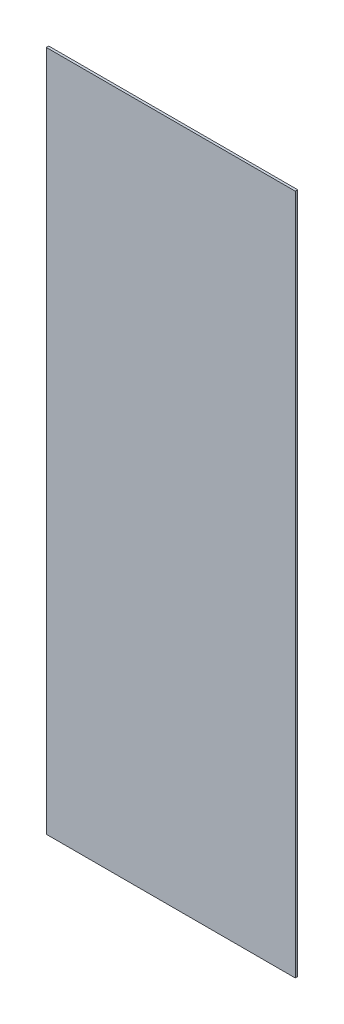
ISO-10303-21;
HEADER;
FILE_DESCRIPTION(('STEP AP214'),'2;1');
FILE_NAME('part.step','',(''),(''),'','','');
FILE_SCHEMA(('AUTOMOTIVE_DESIGN { 1 0 10303 214 1 1 1 1 }'));
ENDSEC;
DATA;
#1=APPLICATION_CONTEXT('core data for automotive mechanical design processes');
#2=APPLICATION_PROTOCOL_DEFINITION('international standard','automotive_design',2000,#1);
#3=PRODUCT_CONTEXT('',#1,'mechanical');
#4=PRODUCT('Part','Part','',(#3));
#5=PRODUCT_RELATED_PRODUCT_CATEGORY('part','',(#4));
#6=PRODUCT_DEFINITION_FORMATION('','',#4);
#7=PRODUCT_DEFINITION_CONTEXT('part definition',#1,'design');
#8=PRODUCT_DEFINITION('design','',#6,#7);
#9=PRODUCT_DEFINITION_SHAPE('','',#8);
#10=(LENGTH_UNIT() NAMED_UNIT(*) SI_UNIT(.MILLI.,.METRE.));
#11=(NAMED_UNIT(*) PLANE_ANGLE_UNIT() SI_UNIT($,.RADIAN.));
#12=(NAMED_UNIT(*) SI_UNIT($,.STERADIAN.) SOLID_ANGLE_UNIT());
#13=UNCERTAINTY_MEASURE_WITH_UNIT(LENGTH_MEASURE(1.E-05),#10,'distance_accuracy_value','');
#14=(GEOMETRIC_REPRESENTATION_CONTEXT(3) GLOBAL_UNCERTAINTY_ASSIGNED_CONTEXT((#13)) GLOBAL_UNIT_ASSIGNED_CONTEXT((#10,
#11,#12)) REPRESENTATION_CONTEXT('',''));
#15=CARTESIAN_POINT('',(0.,0.,0.));
#16=DIRECTION('',(0.,0.,1.));
#17=DIRECTION('',(1.,0.,0.));
#18=AXIS2_PLACEMENT_3D('',#15,#16,#17);
#19=CARTESIAN_POINT('',(28.125,177.7,-0.49));
#20=DIRECTION('',(0.,0.,1.));
#21=DIRECTION('',(1.,0.,0.));
#22=AXIS2_PLACEMENT_3D('',#19,#20,#21);
#23=PLANE('',#22);
#24=CARTESIAN_POINT('',(28.125,177.7,-0.49));
#25=DIRECTION('',(0.,0.,1.));
#26=DIRECTION('',(1.,0.,0.));
#27=AXIS2_PLACEMENT_3D('',#24,#25,#26);
#28=CIRCLE('',#27,0.5);
#29=CARTESIAN_POINT('',(28.625,177.7,-0.49));
#30=VERTEX_POINT('',#29);
#31=EDGE_CURVE('E19',#30,#30,#28,.F.);
#32=ORIENTED_EDGE('',*,*,#31,.T.);
#33=EDGE_LOOP('',(#32));
#34=FACE_BOUND('',#33,.T.);
#35=ADVANCED_FACE('F16',(#34),#23,.F.);
#36=CARTESIAN_POINT('',(28.125,-57.7,-0.49));
#37=DIRECTION('',(0.,0.,1.));
#38=DIRECTION('',(1.,0.,0.));
#39=AXIS2_PLACEMENT_3D('',#36,#37,#38);
#40=PLANE('',#39);
#41=CARTESIAN_POINT('',(28.125,-57.7,-0.49));
#42=DIRECTION('',(0.,0.,1.));
#43=DIRECTION('',(1.,0.,0.));
#44=AXIS2_PLACEMENT_3D('',#41,#42,#43);
#45=CIRCLE('',#44,0.5);
#46=CARTESIAN_POINT('',(28.625,-57.7,-0.49));
#47=VERTEX_POINT('',#46);
#48=EDGE_CURVE('E98',#47,#47,#45,.F.);
#49=ORIENTED_EDGE('',*,*,#48,.T.);
#50=EDGE_LOOP('',(#49));
#51=FACE_BOUND('',#50,.T.);
#52=ADVANCED_FACE('F205',(#51),#40,.F.);
#53=CARTESIAN_POINT('',(-28.125,177.7,-0.49));
#54=DIRECTION('',(0.,0.,1.));
#55=DIRECTION('',(1.,0.,0.));
#56=AXIS2_PLACEMENT_3D('',#53,#54,#55);
#57=PLANE('',#56);
#58=CARTESIAN_POINT('',(-28.125,177.7,-0.49));
#59=DIRECTION('',(0.,0.,1.));
#60=DIRECTION('',(1.,0.,0.));
#61=AXIS2_PLACEMENT_3D('',#58,#59,#60);
#62=CIRCLE('',#61,0.5);
#63=CARTESIAN_POINT('',(-27.625,177.7,-0.49));
#64=VERTEX_POINT('',#63);
#65=EDGE_CURVE('E96',#64,#64,#62,.F.);
#66=ORIENTED_EDGE('',*,*,#65,.T.);
#67=EDGE_LOOP('',(#66));
#68=FACE_BOUND('',#67,.T.);
#69=ADVANCED_FACE('F197',(#68),#57,.F.);
#70=CARTESIAN_POINT('',(-28.125,-57.7,-0.49));
#71=DIRECTION('',(0.,0.,1.));
#72=DIRECTION('',(1.,0.,0.));
#73=AXIS2_PLACEMENT_3D('',#70,#71,#72);
#74=PLANE('',#73);
#75=CARTESIAN_POINT('',(-28.125,-57.7,-0.49));
#76=DIRECTION('',(0.,0.,1.));
#77=DIRECTION('',(1.,0.,0.));
#78=AXIS2_PLACEMENT_3D('',#75,#76,#77);
#79=CIRCLE('',#78,0.5);
#80=CARTESIAN_POINT('',(-27.625,-57.7,-0.49));
#81=VERTEX_POINT('',#80);
#82=EDGE_CURVE('E93',#81,#81,#79,.F.);
#83=ORIENTED_EDGE('',*,*,#82,.T.);
#84=EDGE_LOOP('',(#83));
#85=FACE_BOUND('',#84,.T.);
#86=ADVANCED_FACE('F110',(#85),#74,.F.);
#87=CARTESIAN_POINT('',(28.125,177.7,-0.5));
#88=DIRECTION('',(0.,0.,1.));
#89=DIRECTION('',(1.,0.,0.));
#90=AXIS2_PLACEMENT_3D('',#87,#88,#89);
#91=CYLINDRICAL_SURFACE('',#90,0.5);
#92=ORIENTED_EDGE('',*,*,#31,.F.);
#93=EDGE_LOOP('',(#92));
#94=FACE_BOUND('',#93,.T.);
#95=CARTESIAN_POINT('',(28.125,177.7,-0.5));
#96=DIRECTION('',(0.,0.,1.));
#97=DIRECTION('',(1.,0.,0.));
#98=AXIS2_PLACEMENT_3D('',#95,#96,#97);
#99=CIRCLE('',#98,0.5);
#100=CARTESIAN_POINT('',(28.625,177.7,-0.5));
#101=VERTEX_POINT('',#100);
#102=EDGE_CURVE('E90',#101,#101,#99,.F.);
#103=ORIENTED_EDGE('',*,*,#102,.T.);
#104=EDGE_LOOP('',(#103));
#105=FACE_BOUND('',#104,.T.);
#106=ADVANCED_FACE('F106',(#94,#105),#91,.F.);
#107=CARTESIAN_POINT('',(28.125,-57.7,-0.5));
#108=DIRECTION('',(0.,0.,1.));
#109=DIRECTION('',(1.,0.,0.));
#110=AXIS2_PLACEMENT_3D('',#107,#108,#109);
#111=CYLINDRICAL_SURFACE('',#110,0.5);
#112=ORIENTED_EDGE('',*,*,#48,.F.);
#113=EDGE_LOOP('',(#112));
#114=FACE_BOUND('',#113,.T.);
#115=CARTESIAN_POINT('',(28.125,-57.7,-0.5));
#116=DIRECTION('',(0.,0.,1.));
#117=DIRECTION('',(1.,0.,0.));
#118=AXIS2_PLACEMENT_3D('',#115,#116,#117);
#119=CIRCLE('',#118,0.5);
#120=CARTESIAN_POINT('',(28.625,-57.7,-0.5));
#121=VERTEX_POINT('',#120);
#122=EDGE_CURVE('E87',#121,#121,#119,.F.);
#123=ORIENTED_EDGE('',*,*,#122,.T.);
#124=EDGE_LOOP('',(#123));
#125=FACE_BOUND('',#124,.T.);
#126=ADVANCED_FACE('F109',(#114,#125),#111,.F.);
#127=CARTESIAN_POINT('',(-28.125,177.7,-0.5));
#128=DIRECTION('',(0.,0.,1.));
#129=DIRECTION('',(1.,0.,0.));
#130=AXIS2_PLACEMENT_3D('',#127,#128,#129);
#131=CYLINDRICAL_SURFACE('',#130,0.5);
#132=ORIENTED_EDGE('',*,*,#65,.F.);
#133=EDGE_LOOP('',(#132));
#134=FACE_BOUND('',#133,.T.);
#135=CARTESIAN_POINT('',(-28.125,177.7,-0.5));
#136=DIRECTION('',(0.,0.,1.));
#137=DIRECTION('',(1.,0.,0.));
#138=AXIS2_PLACEMENT_3D('',#135,#136,#137);
#139=CIRCLE('',#138,0.5);
#140=CARTESIAN_POINT('',(-27.625,177.7,-0.5));
#141=VERTEX_POINT('',#140);
#142=EDGE_CURVE('E84',#141,#141,#139,.F.);
#143=ORIENTED_EDGE('',*,*,#142,.T.);
#144=EDGE_LOOP('',(#143));
#145=FACE_BOUND('',#144,.T.);
#146=ADVANCED_FACE('F124',(#134,#145),#131,.F.);
#147=CARTESIAN_POINT('',(-28.125,-57.7,-0.5));
#148=DIRECTION('',(0.,0.,1.));
#149=DIRECTION('',(1.,0.,0.));
#150=AXIS2_PLACEMENT_3D('',#147,#148,#149);
#151=CYLINDRICAL_SURFACE('',#150,0.5);
#152=ORIENTED_EDGE('',*,*,#82,.F.);
#153=EDGE_LOOP('',(#152));
#154=FACE_BOUND('',#153,.T.);
#155=CARTESIAN_POINT('',(-28.125,-57.7,-0.5));
#156=DIRECTION('',(0.,0.,1.));
#157=DIRECTION('',(1.,0.,0.));
#158=AXIS2_PLACEMENT_3D('',#155,#156,#157);
#159=CIRCLE('',#158,0.5);
#160=CARTESIAN_POINT('',(-27.625,-57.7,-0.5));
#161=VERTEX_POINT('',#160);
#162=EDGE_CURVE('E68',#161,#161,#159,.F.);
#163=ORIENTED_EDGE('',*,*,#162,.T.);
#164=EDGE_LOOP('',(#163));
#165=FACE_BOUND('',#164,.T.);
#166=ADVANCED_FACE('F115',(#154,#165),#151,.F.);
#167=CARTESIAN_POINT('',(0.,60.,-0.5));
#168=DIRECTION('',(0.,0.,1.));
#169=DIRECTION('',(1.,0.,0.));
#170=AXIS2_PLACEMENT_3D('',#167,#168,#169);
#171=PLANE('',#170);
#172=ORIENTED_EDGE('',*,*,#162,.F.);
#173=EDGE_LOOP('',(#172));
#174=FACE_BOUND('',#173,.T.);
#175=ORIENTED_EDGE('',*,*,#142,.F.);
#176=EDGE_LOOP('',(#175));
#177=FACE_BOUND('',#176,.T.);
#178=ORIENTED_EDGE('',*,*,#122,.F.);
#179=EDGE_LOOP('',(#178));
#180=FACE_BOUND('',#179,.T.);
#181=ORIENTED_EDGE('',*,*,#102,.F.);
#182=EDGE_LOOP('',(#181));
#183=FACE_BOUND('',#182,.T.);
#184=DIRECTION('',(1.,0.,0.));
#185=VECTOR('',#184,1.);
#186=CARTESIAN_POINT('',(-50.675,198.7,-0.5));
#187=LINE('',#186,#185);
#188=CARTESIAN_POINT('',(50.675,198.7,-0.5));
#189=VERTEX_POINT('',#188);
#190=CARTESIAN_POINT('',(-50.675,198.7,-0.5));
#191=VERTEX_POINT('',#190);
#192=EDGE_CURVE('E59',#189,#191,#187,.F.);
#193=ORIENTED_EDGE('',*,*,#192,.F.);
#194=DIRECTION('',(0.,1.,0.));
#195=VECTOR('',#194,1.);
#196=CARTESIAN_POINT('',(50.675,198.7,-0.5));
#197=LINE('',#196,#195);
#198=CARTESIAN_POINT('',(50.675,-78.7,-0.5));
#199=VERTEX_POINT('',#198);
#200=EDGE_CURVE('E227',#199,#189,#197,.T.);
#201=ORIENTED_EDGE('',*,*,#200,.F.);
#202=DIRECTION('',(1.,0.,0.));
#203=VECTOR('',#202,1.);
#204=CARTESIAN_POINT('',(50.675,-78.7,-0.5));
#205=LINE('',#204,#203);
#206=CARTESIAN_POINT('',(-50.675,-78.7,-0.5));
#207=VERTEX_POINT('',#206);
#208=EDGE_CURVE('E71',#207,#199,#205,.T.);
#209=ORIENTED_EDGE('',*,*,#208,.F.);
#210=DIRECTION('',(0.,1.,0.));
#211=VECTOR('',#210,1.);
#212=CARTESIAN_POINT('',(-50.675,-78.7,-0.5));
#213=LINE('',#212,#211);
#214=EDGE_CURVE('E54',#191,#207,#213,.F.);
#215=ORIENTED_EDGE('',*,*,#214,.F.);
#216=EDGE_LOOP('',(#193,#201,#209,#215));
#217=FACE_BOUND('',#216,.T.);
#218=ADVANCED_FACE('F70',(#174,#177,#180,#183,#217),#171,.F.);
#219=CARTESIAN_POINT('',(-50.675,198.7,-0.5));
#220=DIRECTION('',(0.,1.,0.));
#221=DIRECTION('',(0.,0.,1.));
#222=AXIS2_PLACEMENT_3D('',#219,#220,#221);
#223=PLANE('',#222);
#224=ORIENTED_EDGE('',*,*,#192,.T.);
#225=DIRECTION('',(0.,0.,1.));
#226=VECTOR('',#225,1.);
#227=CARTESIAN_POINT('',(-50.675,198.7,-0.5));
#228=LINE('',#227,#226);
#229=CARTESIAN_POINT('',(-50.675,198.7,0.5));
#230=VERTEX_POINT('',#229);
#231=EDGE_CURVE('E61',#230,#191,#228,.F.);
#232=ORIENTED_EDGE('',*,*,#231,.F.);
#233=DIRECTION('',(1.,0.,0.));
#234=VECTOR('',#233,1.);
#235=CARTESIAN_POINT('',(0.,198.7,0.5));
#236=LINE('',#235,#234);
#237=CARTESIAN_POINT('',(50.675,198.7,0.5));
#238=VERTEX_POINT('',#237);
#239=EDGE_CURVE('E232',#238,#230,#236,.F.);
#240=ORIENTED_EDGE('',*,*,#239,.F.);
#241=DIRECTION('',(0.,0.,-1.));
#242=VECTOR('',#241,1.);
#243=CARTESIAN_POINT('',(50.675,198.7,-0.5));
#244=LINE('',#243,#242);
#245=EDGE_CURVE('E64',#189,#238,#244,.F.);
#246=ORIENTED_EDGE('',*,*,#245,.F.);
#247=EDGE_LOOP('',(#224,#232,#240,#246));
#248=FACE_BOUND('',#247,.T.);
#249=ADVANCED_FACE('F60',(#248),#223,.T.);
#250=CARTESIAN_POINT('',(-50.675,-78.7,-0.5));
#251=DIRECTION('',(-1.,0.,0.));
#252=DIRECTION('',(0.,0.,1.));
#253=AXIS2_PLACEMENT_3D('',#250,#251,#252);
#254=PLANE('',#253);
#255=ORIENTED_EDGE('',*,*,#214,.T.);
#256=DIRECTION('',(0.,0.,-1.));
#257=VECTOR('',#256,1.);
#258=CARTESIAN_POINT('',(-50.675,-78.7,-0.5));
#259=LINE('',#258,#257);
#260=CARTESIAN_POINT('',(-50.675,-78.7,0.5));
#261=VERTEX_POINT('',#260);
#262=EDGE_CURVE('E73',#261,#207,#259,.T.);
#263=ORIENTED_EDGE('',*,*,#262,.F.);
#264=DIRECTION('',(0.,1.,0.));
#265=VECTOR('',#264,1.);
#266=CARTESIAN_POINT('',(-50.675,60.,0.5));
#267=LINE('',#266,#265);
#268=EDGE_CURVE('E77',#230,#261,#267,.F.);
#269=ORIENTED_EDGE('',*,*,#268,.F.);
#270=ORIENTED_EDGE('',*,*,#231,.T.);
#271=EDGE_LOOP('',(#255,#263,#269,#270));
#272=FACE_BOUND('',#271,.T.);
#273=ADVANCED_FACE('F75',(#272),#254,.T.);
#274=CARTESIAN_POINT('',(50.675,-78.7,-0.5));
#275=DIRECTION('',(0.,-1.,0.));
#276=DIRECTION('',(0.,0.,-1.));
#277=AXIS2_PLACEMENT_3D('',#274,#275,#276);
#278=PLANE('',#277);
#279=ORIENTED_EDGE('',*,*,#208,.T.);
#280=DIRECTION('',(0.,0.,-1.));
#281=VECTOR('',#280,1.);
#282=CARTESIAN_POINT('',(50.675,-78.7,-0.5));
#283=LINE('',#282,#281);
#284=CARTESIAN_POINT('',(50.675,-78.7,0.5));
#285=VERTEX_POINT('',#284);
#286=EDGE_CURVE('E34',#285,#199,#283,.T.);
#287=ORIENTED_EDGE('',*,*,#286,.F.);
#288=DIRECTION('',(1.,0.,0.));
#289=VECTOR('',#288,1.);
#290=CARTESIAN_POINT('',(0.,-78.7,0.5));
#291=LINE('',#290,#289);
#292=EDGE_CURVE('E25',#261,#285,#291,.T.);
#293=ORIENTED_EDGE('',*,*,#292,.F.);
#294=ORIENTED_EDGE('',*,*,#262,.T.);
#295=EDGE_LOOP('',(#279,#287,#293,#294));
#296=FACE_BOUND('',#295,.T.);
#297=ADVANCED_FACE('F137',(#296),#278,.T.);
#298=CARTESIAN_POINT('',(50.675,198.7,-0.5));
#299=DIRECTION('',(1.,0.,0.));
#300=DIRECTION('',(0.,0.,-1.));
#301=AXIS2_PLACEMENT_3D('',#298,#299,#300);
#302=PLANE('',#301);
#303=ORIENTED_EDGE('',*,*,#200,.T.);
#304=ORIENTED_EDGE('',*,*,#245,.T.);
#305=DIRECTION('',(0.,1.,0.));
#306=VECTOR('',#305,1.);
#307=CARTESIAN_POINT('',(50.675,60.,0.5));
#308=LINE('',#307,#306);
#309=EDGE_CURVE('E11',#285,#238,#308,.T.);
#310=ORIENTED_EDGE('',*,*,#309,.F.);
#311=ORIENTED_EDGE('',*,*,#286,.T.);
#312=EDGE_LOOP('',(#303,#304,#310,#311));
#313=FACE_BOUND('',#312,.T.);
#314=ADVANCED_FACE('F131',(#313),#302,.T.);
#315=CARTESIAN_POINT('',(0.,60.,0.5));
#316=DIRECTION('',(0.,0.,1.));
#317=DIRECTION('',(1.,0.,0.));
#318=AXIS2_PLACEMENT_3D('',#315,#316,#317);
#319=PLANE('',#318);
#320=ORIENTED_EDGE('',*,*,#292,.T.);
#321=ORIENTED_EDGE('',*,*,#309,.T.);
#322=ORIENTED_EDGE('',*,*,#239,.T.);
#323=ORIENTED_EDGE('',*,*,#268,.T.);
#324=EDGE_LOOP('',(#320,#321,#322,#323));
#325=FACE_BOUND('',#324,.T.);
#326=ADVANCED_FACE('F129',(#325),#319,.T.);
#327=CLOSED_SHELL('',(#35,#52,#69,#86,#106,#126,#146,#166,#218,#249,#273,#297,#314,#326));
#328=MANIFOLD_SOLID_BREP('B1',#327);
#329=ADVANCED_BREP_SHAPE_REPRESENTATION('',(#18,#328),#14);
#330=SHAPE_DEFINITION_REPRESENTATION(#9,#329);
ENDSEC;
END-ISO-10303-21;
